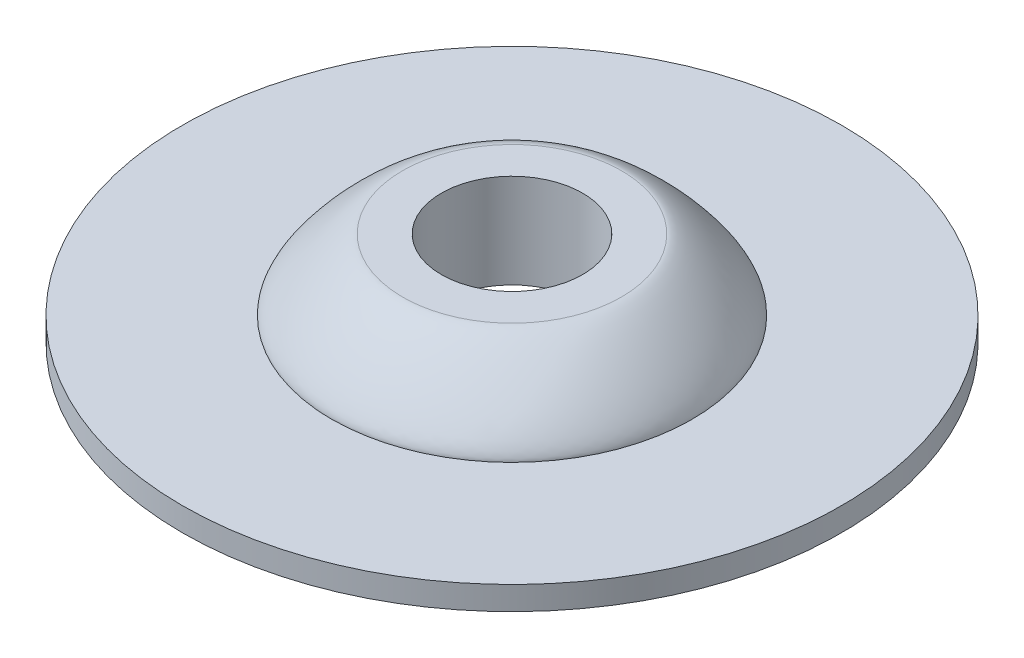
ISO-10303-21;
HEADER;
FILE_DESCRIPTION(('STEP AP214'),'2;1');
FILE_NAME('part.step','',(''),(''),'','','');
FILE_SCHEMA(('AUTOMOTIVE_DESIGN { 1 0 10303 214 1 1 1 1 }'));
ENDSEC;
DATA;
#1=APPLICATION_CONTEXT('core data for automotive mechanical design processes');
#2=APPLICATION_PROTOCOL_DEFINITION('international standard','automotive_design',2000,#1);
#3=PRODUCT_CONTEXT('',#1,'mechanical');
#4=PRODUCT('Part','Part','',(#3));
#5=PRODUCT_RELATED_PRODUCT_CATEGORY('part','',(#4));
#6=PRODUCT_DEFINITION_FORMATION('','',#4);
#7=PRODUCT_DEFINITION_CONTEXT('part definition',#1,'design');
#8=PRODUCT_DEFINITION('design','',#6,#7);
#9=PRODUCT_DEFINITION_SHAPE('','',#8);
#10=(LENGTH_UNIT() NAMED_UNIT(*) SI_UNIT(.MILLI.,.METRE.));
#11=(NAMED_UNIT(*) PLANE_ANGLE_UNIT() SI_UNIT($,.RADIAN.));
#12=(NAMED_UNIT(*) SI_UNIT($,.STERADIAN.) SOLID_ANGLE_UNIT());
#13=UNCERTAINTY_MEASURE_WITH_UNIT(LENGTH_MEASURE(1.E-05),#10,'distance_accuracy_value','');
#14=(GEOMETRIC_REPRESENTATION_CONTEXT(3) GLOBAL_UNCERTAINTY_ASSIGNED_CONTEXT((#13)) GLOBAL_UNIT_ASSIGNED_CONTEXT((#10,
#11,#12)) REPRESENTATION_CONTEXT('',''));
#15=CARTESIAN_POINT('',(0.,0.,0.));
#16=DIRECTION('',(0.,0.,1.));
#17=DIRECTION('',(1.,0.,0.));
#18=AXIS2_PLACEMENT_3D('',#15,#16,#17);
#19=CARTESIAN_POINT('',(0.,1.,0.));
#20=DIRECTION('',(0.,1.,0.));
#21=DIRECTION('',(0.,0.,1.));
#22=AXIS2_PLACEMENT_3D('',#19,#20,#21);
#23=PLANE('',#22);
#24=CARTESIAN_POINT('',(0.,1.,0.));
#25=DIRECTION('',(0.,1.,0.));
#26=DIRECTION('',(0.,0.,1.));
#27=AXIS2_PLACEMENT_3D('',#24,#25,#26);
#28=CIRCLE('',#27,14.);
#29=CARTESIAN_POINT('',(0.,1.,14.));
#30=VERTEX_POINT('',#29);
#31=EDGE_CURVE('E54',#30,#30,#28,.T.);
#32=ORIENTED_EDGE('',*,*,#31,.T.);
#33=EDGE_LOOP('',(#32));
#34=FACE_BOUND('',#33,.T.);
#35=CARTESIAN_POINT('',(0.,1.,7.65));
#36=CARTESIAN_POINT('',(1.00138265061318,1.,7.65));
#37=CARTESIAN_POINT('',(2.00237132247962,1.,7.4508909735588));
#38=CARTESIAN_POINT('',(3.85268519270625,1.,6.68446587386388));
#39=CARTESIAN_POINT('',(4.70128241326616,1.,6.11745133888802));
#40=CARTESIAN_POINT('',(6.11745133888802,1.,4.70128241326616));
#41=CARTESIAN_POINT('',(6.68446587386393,1.,3.85268519270614));
#42=CARTESIAN_POINT('',(7.45089097355876,1.,2.00237132247973));
#43=CARTESIAN_POINT('',(7.65,1.,1.00138265061307));
#44=CARTESIAN_POINT('',(7.65,1.,-1.00138265061307));
#45=CARTESIAN_POINT('',(7.45089097355887,1.,-2.00237132247946));
#46=CARTESIAN_POINT('',(6.68446587386381,1.,-3.85268519270642));
#47=CARTESIAN_POINT('',(6.11745133888822,1.,-4.70128241326596));
#48=CARTESIAN_POINT('',(4.70128241326595,1.,-6.11745133888823));
#49=CARTESIAN_POINT('',(3.85268519270633,1.,-6.68446587386385));
#50=CARTESIAN_POINT('',(2.00237132247956,1.,-7.45089097355883));
#51=CARTESIAN_POINT('',(1.00138265061307,1.,-7.65));
#52=CARTESIAN_POINT('',(-1.00138265061307,1.,-7.65));
#53=CARTESIAN_POINT('',(-2.00237132247956,1.,-7.45089097355883));
#54=CARTESIAN_POINT('',(-3.8526851927063,1.,-6.68446587386387));
#55=CARTESIAN_POINT('',(-4.70128241326596,1.,-6.11745133888822));
#56=CARTESIAN_POINT('',(-6.11745133888822,1.,-4.70128241326595));
#57=CARTESIAN_POINT('',(-6.68446587386394,1.,-3.85268519270611));
#58=CARTESIAN_POINT('',(-7.45089097355874,1.,-2.00237132247978));
#59=CARTESIAN_POINT('',(-7.65,1.,-1.00138265061306));
#60=CARTESIAN_POINT('',(-7.65,1.,1.00138265061308));
#61=CARTESIAN_POINT('',(-7.45089097355888,1.,2.00237132247944));
#62=CARTESIAN_POINT('',(-6.68446587386382,1.,3.85268519270641));
#63=CARTESIAN_POINT('',(-6.11745133888784,1.,4.70128241326633));
#64=CARTESIAN_POINT('',(-4.70128241326637,1.,6.11745133888781));
#65=CARTESIAN_POINT('',(-3.85268519270622,1.,6.68446587386389));
#66=CARTESIAN_POINT('',(-2.00237132247967,1.,7.45089097355879));
#67=CARTESIAN_POINT('',(-1.00138265061318,1.,7.65));
#68=CARTESIAN_POINT('',(0.,1.,7.65));
#69=(BOUNDED_CURVE() B_SPLINE_CURVE(3,(#35,#36,#37,#38,#39,#40,#41,#42,#43,#44,#45,#46,#47,#48,
#49,#50,#51,#52,#53,#54,#55,#56,#57,#58,#59,#60,#61,#62,#63,#64,#65,#66,#67,#68),.UNSPECIFIED.,
.T.,.F.) B_SPLINE_CURVE_WITH_KNOTS((4,2,2,2,2,2,2,2,2,2,2,2,2,2,2,2,4),(0.,0.392699081698724,
0.785398163397448,1.17809724509617,1.5707963267949,1.96349540849362,2.35619449019234,
2.74889357189107,3.14159265358979,3.53429173528852,3.92699081698724,4.31968989868597,
4.71238898038469,5.10508806208341,5.49778714378214,5.89048622548086,6.28318530717959),
.UNSPECIFIED.) CURVE() GEOMETRIC_REPRESENTATION_ITEM() RATIONAL_B_SPLINE_CURVE((1.,1.,1.,1.,1.,
1.,1.,1.,1.,1.,1.,1.,1.,1.,1.,1.,1.,1.,1.,1.,1.,1.,1.,1.,1.,1.,1.,1.,1.,1.,1.,1.,1.,1.)) REPRESENTATION_ITEM(''));
#70=CARTESIAN_POINT('',(0.,1.,7.65));
#71=VERTEX_POINT('',#70);
#72=EDGE_CURVE('E102',#71,#71,#69,.T.);
#73=ORIENTED_EDGE('',*,*,#72,.F.);
#74=EDGE_LOOP('',(#73));
#75=FACE_BOUND('',#74,.T.);
#76=ADVANCED_FACE('F40',(#34,#75),#23,.T.);
#77=CARTESIAN_POINT('',(0.,0.,0.));
#78=DIRECTION('',(0.,1.,0.));
#79=DIRECTION('',(0.,0.,1.));
#80=AXIS2_PLACEMENT_3D('',#77,#78,#79);
#81=PLANE('',#80);
#82=CARTESIAN_POINT('',(0.,0.,0.));
#83=DIRECTION('',(0.,1.,0.));
#84=DIRECTION('',(0.,0.,1.));
#85=AXIS2_PLACEMENT_3D('',#82,#83,#84);
#86=CIRCLE('',#85,14.);
#87=CARTESIAN_POINT('',(0.,0.,14.));
#88=VERTEX_POINT('',#87);
#89=EDGE_CURVE('E59',#88,#88,#86,.T.);
#90=ORIENTED_EDGE('',*,*,#89,.F.);
#91=EDGE_LOOP('',(#90));
#92=FACE_BOUND('',#91,.T.);
#93=CARTESIAN_POINT('',(0.,0.,0.));
#94=DIRECTION('',(0.,1.,0.));
#95=DIRECTION('',(0.,0.,1.));
#96=AXIS2_PLACEMENT_3D('',#93,#94,#95);
#97=CIRCLE('',#96,3.);
#98=CARTESIAN_POINT('',(0.,0.,3.));
#99=VERTEX_POINT('',#98);
#100=EDGE_CURVE('E64',#99,#99,#97,.T.);
#101=ORIENTED_EDGE('',*,*,#100,.T.);
#102=EDGE_LOOP('',(#101));
#103=FACE_BOUND('',#102,.T.);
#104=ADVANCED_FACE('F90',(#92,#103),#81,.F.);
#105=CARTESIAN_POINT('',(0.,1.,0.));
#106=DIRECTION('',(0.,-1.,0.));
#107=DIRECTION('',(0.,0.,-1.));
#108=AXIS2_PLACEMENT_3D('',#105,#106,#107);
#109=CYLINDRICAL_SURFACE('',#108,14.);
#110=ORIENTED_EDGE('',*,*,#31,.F.);
#111=EDGE_LOOP('',(#110));
#112=FACE_BOUND('',#111,.T.);
#113=ORIENTED_EDGE('',*,*,#89,.T.);
#114=EDGE_LOOP('',(#113));
#115=FACE_BOUND('',#114,.T.);
#116=ADVANCED_FACE('F85',(#112,#115),#109,.T.);
#117=CARTESIAN_POINT('',(0.,1.,0.));
#118=DIRECTION('',(0.,-1.,0.));
#119=DIRECTION('',(0.,0.,-1.));
#120=AXIS2_PLACEMENT_3D('',#117,#118,#119);
#121=CYLINDRICAL_SURFACE('',#120,3.);
#122=ORIENTED_EDGE('',*,*,#100,.F.);
#123=EDGE_LOOP('',(#122));
#124=FACE_BOUND('',#123,.T.);
#125=CARTESIAN_POINT('',(0.,4.,0.));
#126=DIRECTION('',(0.,1.,0.));
#127=DIRECTION('',(0.,0.,1.));
#128=AXIS2_PLACEMENT_3D('',#125,#126,#127);
#129=CIRCLE('',#128,3.);
#130=CARTESIAN_POINT('',(0.,4.,3.));
#131=VERTEX_POINT('',#130);
#132=EDGE_CURVE('E104',#131,#131,#129,.T.);
#133=ORIENTED_EDGE('',*,*,#132,.T.);
#134=EDGE_LOOP('',(#133));
#135=FACE_BOUND('',#134,.T.);
#136=ADVANCED_FACE('F83',(#124,#135),#121,.F.);
#137=CARTESIAN_POINT('',(0.,4.,0.));
#138=DIRECTION('',(0.,1.,0.));
#139=DIRECTION('',(0.,0.,1.));
#140=AXIS2_PLACEMENT_3D('',#137,#138,#139);
#141=PLANE('',#140);
#142=CARTESIAN_POINT('',(0.,4.,4.65));
#143=CARTESIAN_POINT('',(-0.608683571941348,4.,4.65));
#144=CARTESIAN_POINT('',(-1.21712766660527,4.,4.52897294471207));
#145=CARTESIAN_POINT('',(-2.34182825439008,4.,4.06310670764289));
#146=CARTESIAN_POINT('',(-2.85764225120103,4.,3.71845081383387));
#147=CARTESIAN_POINT('',(-3.71845081383389,4.,2.85764225120101));
#148=CARTESIAN_POINT('',(-4.06310670764263,4.,2.34182825439013));
#149=CARTESIAN_POINT('',(-4.52897294471234,4.,1.21712766660519));
#150=CARTESIAN_POINT('',(-4.65,4.,0.608683571941285));
#151=CARTESIAN_POINT('',(-4.65,4.,-0.608683571941271));
#152=CARTESIAN_POINT('',(-4.52897294471207,4.,-1.21712766660527));
#153=CARTESIAN_POINT('',(-4.06310670764289,4.,-2.34182825439008));
#154=CARTESIAN_POINT('',(-3.71845081383401,4.,-2.85764225120075));
#155=CARTESIAN_POINT('',(-2.85764225120089,4.,-3.71845081383414));
#156=CARTESIAN_POINT('',(-2.34182825439013,4.,-4.06310670764263));
#157=CARTESIAN_POINT('',(-1.21712766660519,4.,-4.52897294471234));
#158=CARTESIAN_POINT('',(-0.608683571941277,4.,-4.65));
#159=CARTESIAN_POINT('',(0.608683571941278,4.,-4.65));
#160=CARTESIAN_POINT('',(1.21712766660527,4.,-4.52897294471207));
#161=CARTESIAN_POINT('',(2.34182825439008,4.,-4.06310670764289));
#162=CARTESIAN_POINT('',(2.85764225120088,4.,-3.71845081383414));
#163=CARTESIAN_POINT('',(3.71845081383401,4.,-2.85764225120075));
#164=CARTESIAN_POINT('',(4.0631067076426,4.,-2.34182825439008));
#165=CARTESIAN_POINT('',(4.52897294471236,4.,-1.21712766660525));
#166=CARTESIAN_POINT('',(4.65,4.,-0.608683571941277));
#167=CARTESIAN_POINT('',(4.65,4.,0.608683571941278));
#168=CARTESIAN_POINT('',(4.5289729447121,4.,1.21712766660525));
#169=CARTESIAN_POINT('',(4.06310670764287,4.,2.34182825439008));
#170=CARTESIAN_POINT('',(3.71845081383396,4.,2.85764225120093));
#171=CARTESIAN_POINT('',(2.85764225120093,4.,3.71845081383396));
#172=CARTESIAN_POINT('',(2.34182825439008,4.,4.06310670764287));
#173=CARTESIAN_POINT('',(1.21712766660525,4.,4.5289729447121));
#174=CARTESIAN_POINT('',(0.608683571941347,4.,4.65));
#175=CARTESIAN_POINT('',(0.,4.,4.65));
#176=(BOUNDED_CURVE() B_SPLINE_CURVE(3,(#142,#143,#144,#145,#146,#147,#148,#149,#150,#151,#152,
#153,#154,#155,#156,#157,#158,#159,#160,#161,#162,#163,#164,#165,#166,#167,#168,#169,#170,#171,
#172,#173,#174,#175),.UNSPECIFIED.,.T.,.F.) B_SPLINE_CURVE_WITH_KNOTS((4,2,2,2,2,2,2,2,2,2,2,2,
2,2,2,2,4),(0.,0.392699081698725,0.785398163397448,1.17809724509617,1.5707963267949,
1.96349540849362,2.35619449019234,2.74889357189107,3.14159265358979,3.53429173528852,
3.92699081698724,4.31968989868597,4.71238898038469,5.10508806208341,5.49778714378214,
5.89048622548086,6.28318530717959),
.UNSPECIFIED.) CURVE() GEOMETRIC_REPRESENTATION_ITEM() RATIONAL_B_SPLINE_CURVE((1.,1.,1.,1.,1.,
1.,1.,1.,1.,1.,1.,1.,1.,1.,1.,1.,1.,1.,1.,1.,1.,1.,1.,1.,1.,1.,1.,1.,1.,1.,1.,1.,1.,1.)) REPRESENTATION_ITEM(''));
#177=CARTESIAN_POINT('',(0.,4.,4.65));
#178=VERTEX_POINT('',#177);
#179=EDGE_CURVE('E11',#178,#178,#176,.F.);
#180=ORIENTED_EDGE('',*,*,#179,.T.);
#181=EDGE_LOOP('',(#180));
#182=FACE_BOUND('',#181,.T.);
#183=ORIENTED_EDGE('',*,*,#132,.F.);
#184=EDGE_LOOP('',(#183));
#185=FACE_BOUND('',#184,.T.);
#186=ADVANCED_FACE('F74',(#182,#185),#141,.T.);
#187=CARTESIAN_POINT('',(0.,4.,4.65));
#188=CARTESIAN_POINT('',(0.608683571941347,4.,4.65));
#189=CARTESIAN_POINT('',(1.21712766660525,4.,4.5289729447121));
#190=CARTESIAN_POINT('',(2.34182825439008,4.,4.06310670764287));
#191=CARTESIAN_POINT('',(2.85764225120093,4.,3.71845081383396));
#192=CARTESIAN_POINT('',(3.71845081383396,4.,2.85764225120093));
#193=CARTESIAN_POINT('',(4.06310670764287,4.,2.34182825439008));
#194=CARTESIAN_POINT('',(4.5289729447121,4.,1.21712766660525));
#195=CARTESIAN_POINT('',(4.65,4.,0.608683571941278));
#196=CARTESIAN_POINT('',(4.65,4.,-0.608683571941277));
#197=CARTESIAN_POINT('',(4.52897294471236,4.,-1.21712766660525));
#198=CARTESIAN_POINT('',(4.0631067076426,4.,-2.34182825439008));
#199=CARTESIAN_POINT('',(3.71845081383401,4.,-2.85764225120075));
#200=CARTESIAN_POINT('',(2.85764225120088,4.,-3.71845081383414));
#201=CARTESIAN_POINT('',(2.34182825439008,4.,-4.06310670764289));
#202=CARTESIAN_POINT('',(1.21712766660527,4.,-4.52897294471207));
#203=CARTESIAN_POINT('',(0.608683571941278,4.,-4.65));
#204=CARTESIAN_POINT('',(-0.608683571941277,4.,-4.65));
#205=CARTESIAN_POINT('',(-1.21712766660519,4.,-4.52897294471234));
#206=CARTESIAN_POINT('',(-2.34182825439013,4.,-4.06310670764263));
#207=CARTESIAN_POINT('',(-2.85764225120089,4.,-3.71845081383414));
#208=CARTESIAN_POINT('',(-3.71845081383401,4.,-2.85764225120075));
#209=CARTESIAN_POINT('',(-4.06310670764289,4.,-2.34182825439008));
#210=CARTESIAN_POINT('',(-4.52897294471207,4.,-1.21712766660527));
#211=CARTESIAN_POINT('',(-4.65,4.,-0.608683571941271));
#212=CARTESIAN_POINT('',(-4.65,4.,0.608683571941285));
#213=CARTESIAN_POINT('',(-4.52897294471234,4.,1.21712766660519));
#214=CARTESIAN_POINT('',(-4.06310670764263,4.,2.34182825439013));
#215=CARTESIAN_POINT('',(-3.71845081383389,4.,2.85764225120101));
#216=CARTESIAN_POINT('',(-2.85764225120103,4.,3.71845081383387));
#217=CARTESIAN_POINT('',(-2.34182825439008,4.,4.06310670764289));
#218=CARTESIAN_POINT('',(-1.21712766660527,4.,4.52897294471207));
#219=CARTESIAN_POINT('',(-0.608683571941348,4.,4.65));
#220=CARTESIAN_POINT('',(0.,4.,4.65));
#221=CARTESIAN_POINT('',(0.,4.,7.65));
#222=CARTESIAN_POINT('',(1.00138265061318,4.00000000000053,7.65000000000053));
#223=CARTESIAN_POINT('',(2.00237132247948,4.,7.45089097355846));
#224=CARTESIAN_POINT('',(3.85268519270639,4.,6.68446587386423));
#225=CARTESIAN_POINT('',(4.70128241326616,4.,6.11745133888802));
#226=CARTESIAN_POINT('',(6.11745133888802,4.,4.70128241326616));
#227=CARTESIAN_POINT('',(6.68446587386396,4.,3.85268519270626));
#228=CARTESIAN_POINT('',(7.45089097355873,4.,2.00237132247961));
#229=CARTESIAN_POINT('',(7.65,4.,1.00138265061307));
#230=CARTESIAN_POINT('',(7.65,4.,-1.00138265061307));
#231=CARTESIAN_POINT('',(7.45089097355925,4.,-2.00237132247962));
#232=CARTESIAN_POINT('',(6.68446587386343,4.,-3.85268519270626));
#233=CARTESIAN_POINT('',(6.11745133888822,4.,-4.70128241326596));
#234=CARTESIAN_POINT('',(4.70128241326595,4.,-6.11745133888823));
#235=CARTESIAN_POINT('',(3.85268519270643,4.,-6.68446587386409));
#236=CARTESIAN_POINT('',(2.00237132247946,4.,-7.45089097355859));
#237=CARTESIAN_POINT('',(1.00138265061307,4.,-7.65));
#238=CARTESIAN_POINT('',(-1.00138265061307,4.,-7.65));
#239=CARTESIAN_POINT('',(-2.00237132247957,4.,-7.45089097355913));
#240=CARTESIAN_POINT('',(-3.85268519270628,4.,-6.68446587386357));
#241=CARTESIAN_POINT('',(-4.70128241326596,4.,-6.11745133888822));
#242=CARTESIAN_POINT('',(-6.11745133888823,4.,-4.70128241326595));
#243=CARTESIAN_POINT('',(-6.68446587386409,4.,-3.85268519270617));
#244=CARTESIAN_POINT('',(-7.45089097355859,4.,-2.00237132247972));
#245=CARTESIAN_POINT('',(-7.65,4.,-1.00138265061306));
#246=CARTESIAN_POINT('',(-7.65,4.,1.00138265061308));
#247=CARTESIAN_POINT('',(-7.45089097355886,4.,2.00237132247944));
#248=CARTESIAN_POINT('',(-6.68446587386383,4.,3.85268519270641));
#249=CARTESIAN_POINT('',(-6.11745133888824,4.,4.70128241326647));
#250=CARTESIAN_POINT('',(-4.70128241326597,4.,6.11745133888768));
#251=CARTESIAN_POINT('',(-3.85268519270643,4.,6.68446587386409));
#252=CARTESIAN_POINT('',(-2.00237132247946,4.,7.45089097355859));
#253=CARTESIAN_POINT('',(-1.00138265061318,3.99999999999947,7.64999999999947));
#254=CARTESIAN_POINT('',(0.,4.,7.65));
#255=CARTESIAN_POINT('',(0.,1.,7.65));
#256=CARTESIAN_POINT('',(1.00138265061318,1.,7.65));
#257=CARTESIAN_POINT('',(2.00237132247962,1.,7.4508909735588));
#258=CARTESIAN_POINT('',(3.85268519270625,1.,6.68446587386388));
#259=CARTESIAN_POINT('',(4.70128241326616,1.,6.11745133888802));
#260=CARTESIAN_POINT('',(6.11745133888802,1.,4.70128241326616));
#261=CARTESIAN_POINT('',(6.68446587386393,1.,3.85268519270614));
#262=CARTESIAN_POINT('',(7.45089097355876,1.,2.00237132247973));
#263=CARTESIAN_POINT('',(7.65,1.,1.00138265061307));
#264=CARTESIAN_POINT('',(7.65,1.,-1.00138265061307));
#265=CARTESIAN_POINT('',(7.45089097355887,1.,-2.00237132247946));
#266=CARTESIAN_POINT('',(6.68446587386381,1.,-3.85268519270642));
#267=CARTESIAN_POINT('',(6.11745133888822,1.,-4.70128241326596));
#268=CARTESIAN_POINT('',(4.70128241326595,1.,-6.11745133888823));
#269=CARTESIAN_POINT('',(3.85268519270633,1.,-6.68446587386385));
#270=CARTESIAN_POINT('',(2.00237132247956,1.,-7.45089097355883));
#271=CARTESIAN_POINT('',(1.00138265061307,1.,-7.65));
#272=CARTESIAN_POINT('',(-1.00138265061307,1.,-7.65));
#273=CARTESIAN_POINT('',(-2.00237132247956,1.,-7.45089097355883));
#274=CARTESIAN_POINT('',(-3.8526851927063,1.,-6.68446587386387));
#275=CARTESIAN_POINT('',(-4.70128241326596,1.,-6.11745133888822));
#276=CARTESIAN_POINT('',(-6.11745133888822,1.,-4.70128241326595));
#277=CARTESIAN_POINT('',(-6.68446587386394,1.,-3.85268519270611));
#278=CARTESIAN_POINT('',(-7.45089097355874,1.,-2.00237132247978));
#279=CARTESIAN_POINT('',(-7.65,1.,-1.00138265061306));
#280=CARTESIAN_POINT('',(-7.65,1.,1.00138265061308));
#281=CARTESIAN_POINT('',(-7.45089097355888,1.,2.00237132247944));
#282=CARTESIAN_POINT('',(-6.68446587386382,1.,3.85268519270641));
#283=CARTESIAN_POINT('',(-6.11745133888784,1.,4.70128241326633));
#284=CARTESIAN_POINT('',(-4.70128241326637,1.,6.11745133888781));
#285=CARTESIAN_POINT('',(-3.85268519270622,1.,6.68446587386389));
#286=CARTESIAN_POINT('',(-2.00237132247967,1.,7.45089097355879));
#287=CARTESIAN_POINT('',(-1.00138265061318,1.,7.65));
#288=CARTESIAN_POINT('',(0.,1.,7.65));
#289=(BOUNDED_SURFACE() B_SPLINE_SURFACE(2,3,((#187,#188,#189,#190,#191,#192,#193,#194,#195,
#196,#197,#198,#199,#200,#201,#202,#203,#204,#205,#206,#207,#208,#209,#210,#211,#212,#213,#214,
#215,#216,#217,#218,#219,#220),(#221,#222,#223,#224,#225,#226,#227,#228,#229,#230,#231,#232,
#233,#234,#235,#236,#237,#238,#239,#240,#241,#242,#243,#244,#245,#246,#247,#248,#249,#250,#251,
#252,#253,#254),(#255,#256,#257,#258,#259,#260,#261,#262,#263,#264,#265,#266,#267,#268,#269,
#270,#271,#272,#273,#274,#275,#276,#277,#278,#279,#280,#281,#282,#283,#284,#285,#286,#287,
#288)),.UNSPECIFIED.,.F.,.T.,.F.) B_SPLINE_SURFACE_WITH_KNOTS((3,3),(4,2,2,2,2,2,2,2,2,2,2,2,2,
2,2,2,4),(0.,1.),(0.,0.392699081698724,0.785398163397448,1.17809724509617,1.5707963267949,
1.96349540849362,2.35619449019234,2.74889357189107,3.14159265358979,3.53429173528852,
3.92699081698724,4.31968989868597,4.71238898038469,5.10508806208341,5.49778714378214,
5.89048622548086,6.28318530717959),
.UNSPECIFIED.) GEOMETRIC_REPRESENTATION_ITEM() RATIONAL_B_SPLINE_SURFACE(((1.,1.,1.,1.,1.,1.,1.,
1.,1.,1.,1.,1.,1.,1.,1.,1.,1.,1.,1.,1.,1.,1.,1.,1.,1.,1.,1.,1.,1.,1.,1.,1.,1.,1.),
(0.212132034355964,0.212132034355964,0.212132034355964,0.212132034355964,0.212132034355964,
0.212132034355964,0.212132034355964,0.212132034355964,0.212132034355964,0.212132034355964,
0.212132034355964,0.212132034355964,0.212132034355964,0.212132034355964,0.212132034355964,
0.212132034355964,0.212132034355964,0.212132034355964,0.212132034355964,0.212132034355964,
0.212132034355964,0.212132034355964,0.212132034355964,0.212132034355964,0.212132034355964,
0.212132034355964,0.212132034355964,0.212132034355964,0.212132034355964,0.212132034355964,
0.212132034355964,0.212132034355964,0.212132034355964,0.212132034355964),(1.,1.,1.,1.,1.,1.,1.,
1.,1.,1.,1.,1.,1.,1.,1.,1.,1.,1.,1.,1.,1.,1.,1.,1.,1.,1.,1.,1.,1.,1.,1.,1.,1.,1.))) REPRESENTATION_ITEM('') SURFACE());
#290=ORIENTED_EDGE('',*,*,#72,.T.);
#291=EDGE_LOOP('',(#290));
#292=FACE_BOUND('',#291,.T.);
#293=ORIENTED_EDGE('',*,*,#179,.F.);
#294=EDGE_LOOP('',(#293));
#295=FACE_BOUND('',#294,.T.);
#296=ADVANCED_FACE('F43',(#292,#295),#289,.T.);
#297=CLOSED_SHELL('',(#76,#104,#116,#136,#186,#296));
#298=MANIFOLD_SOLID_BREP('B2',#297);
#299=ADVANCED_BREP_SHAPE_REPRESENTATION('',(#18,#298),#14);
#300=SHAPE_DEFINITION_REPRESENTATION(#9,#299);
ENDSEC;
END-ISO-10303-21;
